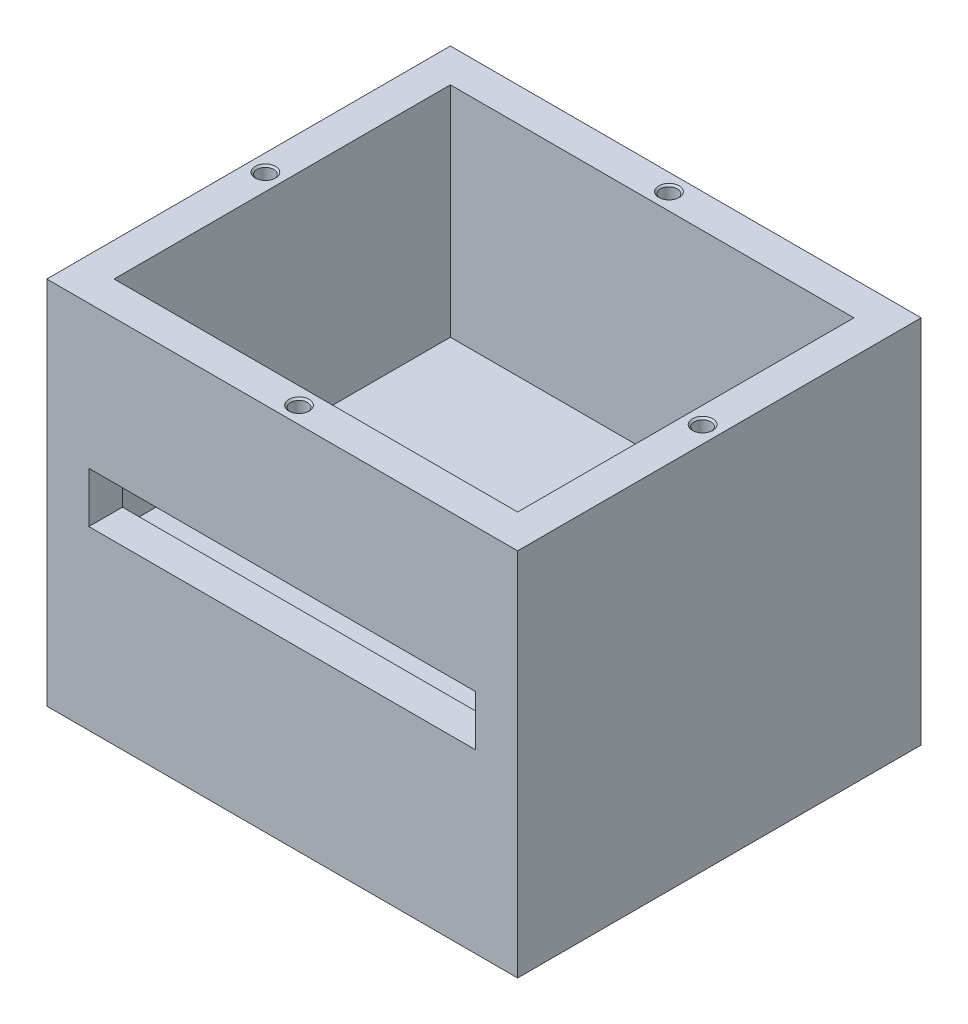
ISO-10303-21;
HEADER;
FILE_DESCRIPTION(('STEP AP214'),'2;1');
FILE_NAME('part.step','',(''),(''),'','','');
FILE_SCHEMA(('AUTOMOTIVE_DESIGN { 1 0 10303 214 1 1 1 1 }'));
ENDSEC;
DATA;
#1=APPLICATION_CONTEXT('core data for automotive mechanical design processes');
#2=APPLICATION_PROTOCOL_DEFINITION('international standard','automotive_design',2000,#1);
#3=PRODUCT_CONTEXT('',#1,'mechanical');
#4=PRODUCT('Part','Part','',(#3));
#5=PRODUCT_RELATED_PRODUCT_CATEGORY('part','',(#4));
#6=PRODUCT_DEFINITION_FORMATION('','',#4);
#7=PRODUCT_DEFINITION_CONTEXT('part definition',#1,'design');
#8=PRODUCT_DEFINITION('design','',#6,#7);
#9=PRODUCT_DEFINITION_SHAPE('','',#8);
#10=(LENGTH_UNIT() NAMED_UNIT(*) SI_UNIT(.MILLI.,.METRE.));
#11=(NAMED_UNIT(*) PLANE_ANGLE_UNIT() SI_UNIT($,.RADIAN.));
#12=(NAMED_UNIT(*) SI_UNIT($,.STERADIAN.) SOLID_ANGLE_UNIT());
#13=UNCERTAINTY_MEASURE_WITH_UNIT(LENGTH_MEASURE(1.E-05),#10,'distance_accuracy_value','');
#14=(GEOMETRIC_REPRESENTATION_CONTEXT(3) GLOBAL_UNCERTAINTY_ASSIGNED_CONTEXT((#13)) GLOBAL_UNIT_ASSIGNED_CONTEXT((#10,
#11,#12)) REPRESENTATION_CONTEXT('',''));
#15=CARTESIAN_POINT('',(0.,0.,0.));
#16=DIRECTION('',(0.,0.,1.));
#17=DIRECTION('',(1.,0.,0.));
#18=AXIS2_PLACEMENT_3D('',#15,#16,#17);
#19=CARTESIAN_POINT('',(0.,45.,0.));
#20=DIRECTION('',(0.,1.,0.));
#21=DIRECTION('',(0.,0.,1.));
#22=AXIS2_PLACEMENT_3D('',#19,#20,#21);
#23=PLANE('',#22);
#24=CARTESIAN_POINT('',(-15.,45.,0.));
#25=DIRECTION('',(0.,1.,0.));
#26=DIRECTION('',(0.,0.,1.));
#27=AXIS2_PLACEMENT_3D('',#24,#25,#26);
#28=CIRCLE('',#27,14.);
#29=CARTESIAN_POINT('',(-15.,45.,14.));
#30=VERTEX_POINT('',#29);
#31=EDGE_CURVE('E189',#30,#30,#28,.T.);
#32=ORIENTED_EDGE('',*,*,#31,.F.);
#33=EDGE_LOOP('',(#32));
#34=FACE_BOUND('',#33,.T.);
#35=CARTESIAN_POINT('',(15.,45.,0.));
#36=DIRECTION('',(0.,1.,0.));
#37=DIRECTION('',(0.,0.,-1.));
#38=AXIS2_PLACEMENT_3D('',#35,#36,#37);
#39=CIRCLE('',#38,14.);
#40=CARTESIAN_POINT('',(15.,45.,-14.));
#41=VERTEX_POINT('',#40);
#42=EDGE_CURVE('E184',#41,#41,#39,.T.);
#43=ORIENTED_EDGE('',*,*,#42,.F.);
#44=EDGE_LOOP('',(#43));
#45=FACE_BOUND('',#44,.T.);
#46=DIRECTION('',(0.,0.,1.));
#47=VECTOR('',#46,1.);
#48=CARTESIAN_POINT('',(-60.,45.,-50.));
#49=LINE('',#48,#47);
#50=CARTESIAN_POINT('',(-60.,45.,-50.));
#51=VERTEX_POINT('',#50);
#52=CARTESIAN_POINT('',(-60.,45.,50.));
#53=VERTEX_POINT('',#52);
#54=EDGE_CURVE('E232',#51,#53,#49,.T.);
#55=ORIENTED_EDGE('',*,*,#54,.T.);
#56=DIRECTION('',(1.,0.,0.));
#57=VECTOR('',#56,1.);
#58=CARTESIAN_POINT('',(-60.,45.,50.));
#59=LINE('',#58,#57);
#60=CARTESIAN_POINT('',(60.,45.,50.));
#61=VERTEX_POINT('',#60);
#62=EDGE_CURVE('E235',#53,#61,#59,.T.);
#63=ORIENTED_EDGE('',*,*,#62,.T.);
#64=DIRECTION('',(0.,0.,-1.));
#65=VECTOR('',#64,1.);
#66=CARTESIAN_POINT('',(60.,45.,-50.));
#67=LINE('',#66,#65);
#68=CARTESIAN_POINT('',(60.,45.,-50.));
#69=VERTEX_POINT('',#68);
#70=EDGE_CURVE('E239',#61,#69,#67,.T.);
#71=ORIENTED_EDGE('',*,*,#70,.T.);
#72=DIRECTION('',(-1.,0.,0.));
#73=VECTOR('',#72,1.);
#74=CARTESIAN_POINT('',(-60.,45.,-50.));
#75=LINE('',#74,#73);
#76=EDGE_CURVE('E242',#69,#51,#75,.T.);
#77=ORIENTED_EDGE('',*,*,#76,.T.);
#78=EDGE_LOOP('',(#55,#63,#71,#77));
#79=FACE_BOUND('',#78,.T.);
#80=ADVANCED_FACE('F39',(#34,#45,#79),#23,.T.);
#81=CARTESIAN_POINT('',(-70.,110.,60.));
#82=DIRECTION('',(1.,0.,0.));
#83=DIRECTION('',(0.,0.,-1.));
#84=AXIS2_PLACEMENT_3D('',#81,#82,#83);
#85=PLANE('',#84);
#86=DIRECTION('',(0.,0.,1.));
#87=VECTOR('',#86,1.);
#88=CARTESIAN_POINT('',(-70.,0.,60.));
#89=LINE('',#88,#87);
#90=CARTESIAN_POINT('',(-70.,0.,-60.));
#91=VERTEX_POINT('',#90);
#92=CARTESIAN_POINT('',(-70.,0.,60.));
#93=VERTEX_POINT('',#92);
#94=EDGE_CURVE('E257',#91,#93,#89,.T.);
#95=ORIENTED_EDGE('',*,*,#94,.T.);
#96=DIRECTION('',(0.,-1.,0.));
#97=VECTOR('',#96,1.);
#98=CARTESIAN_POINT('',(-70.,110.,60.));
#99=LINE('',#98,#97);
#100=CARTESIAN_POINT('',(-70.,110.,60.));
#101=VERTEX_POINT('',#100);
#102=EDGE_CURVE('E11',#101,#93,#99,.T.);
#103=ORIENTED_EDGE('',*,*,#102,.F.);
#104=DIRECTION('',(0.,0.,1.));
#105=VECTOR('',#104,1.);
#106=CARTESIAN_POINT('',(-70.,110.,60.));
#107=LINE('',#106,#105);
#108=CARTESIAN_POINT('',(-70.,110.,-60.));
#109=VERTEX_POINT('',#108);
#110=EDGE_CURVE('E264',#109,#101,#107,.T.);
#111=ORIENTED_EDGE('',*,*,#110,.F.);
#112=DIRECTION('',(0.,-1.,0.));
#113=VECTOR('',#112,1.);
#114=CARTESIAN_POINT('',(-70.,110.,-60.));
#115=LINE('',#114,#113);
#116=EDGE_CURVE('E274',#109,#91,#115,.T.);
#117=ORIENTED_EDGE('',*,*,#116,.T.);
#118=EDGE_LOOP('',(#95,#103,#111,#117));
#119=FACE_BOUND('',#118,.T.);
#120=ADVANCED_FACE('F41',(#119),#85,.F.);
#121=CARTESIAN_POINT('',(-70.,110.,60.));
#122=DIRECTION('',(0.,0.,-1.));
#123=DIRECTION('',(-1.,0.,0.));
#124=AXIS2_PLACEMENT_3D('',#121,#122,#123);
#125=PLANE('',#124);
#126=DIRECTION('',(1.,0.,0.));
#127=VECTOR('',#126,1.);
#128=CARTESIAN_POINT('',(-57.5,52.5,60.));
#129=LINE('',#128,#127);
#130=CARTESIAN_POINT('',(-57.5,52.5,60.));
#131=VERTEX_POINT('',#130);
#132=CARTESIAN_POINT('',(57.5,52.5,60.));
#133=VERTEX_POINT('',#132);
#134=EDGE_CURVE('E216',#131,#133,#129,.T.);
#135=ORIENTED_EDGE('',*,*,#134,.F.);
#136=DIRECTION('',(0.,-1.,0.));
#137=VECTOR('',#136,1.);
#138=CARTESIAN_POINT('',(-57.5,67.5,60.));
#139=LINE('',#138,#137);
#140=CARTESIAN_POINT('',(-57.5,67.5,60.));
#141=VERTEX_POINT('',#140);
#142=EDGE_CURVE('E56',#141,#131,#139,.T.);
#143=ORIENTED_EDGE('',*,*,#142,.F.);
#144=DIRECTION('',(-1.,0.,0.));
#145=VECTOR('',#144,1.);
#146=CARTESIAN_POINT('',(-57.5,67.5,60.));
#147=LINE('',#146,#145);
#148=CARTESIAN_POINT('',(57.5,67.5,60.));
#149=VERTEX_POINT('',#148);
#150=EDGE_CURVE('E207',#149,#141,#147,.T.);
#151=ORIENTED_EDGE('',*,*,#150,.F.);
#152=DIRECTION('',(0.,1.,0.));
#153=VECTOR('',#152,1.);
#154=CARTESIAN_POINT('',(57.5,67.5,60.));
#155=LINE('',#154,#153);
#156=EDGE_CURVE('E219',#133,#149,#155,.T.);
#157=ORIENTED_EDGE('',*,*,#156,.F.);
#158=EDGE_LOOP('',(#135,#143,#151,#157));
#159=FACE_BOUND('',#158,.T.);
#160=DIRECTION('',(1.,0.,0.));
#161=VECTOR('',#160,1.);
#162=CARTESIAN_POINT('',(-70.,0.,60.));
#163=LINE('',#162,#161);
#164=CARTESIAN_POINT('',(70.,0.,60.));
#165=VERTEX_POINT('',#164);
#166=EDGE_CURVE('E277',#93,#165,#163,.T.);
#167=ORIENTED_EDGE('',*,*,#166,.T.);
#168=DIRECTION('',(0.,-1.,0.));
#169=VECTOR('',#168,1.);
#170=CARTESIAN_POINT('',(70.,110.,60.));
#171=LINE('',#170,#169);
#172=CARTESIAN_POINT('',(70.,110.,60.));
#173=VERTEX_POINT('',#172);
#174=EDGE_CURVE('E48',#173,#165,#171,.T.);
#175=ORIENTED_EDGE('',*,*,#174,.F.);
#176=DIRECTION('',(1.,0.,0.));
#177=VECTOR('',#176,1.);
#178=CARTESIAN_POINT('',(-70.,110.,60.));
#179=LINE('',#178,#177);
#180=EDGE_CURVE('E267',#101,#173,#179,.T.);
#181=ORIENTED_EDGE('',*,*,#180,.F.);
#182=ORIENTED_EDGE('',*,*,#102,.T.);
#183=EDGE_LOOP('',(#167,#175,#181,#182));
#184=FACE_BOUND('',#183,.T.);
#185=ADVANCED_FACE('F347',(#159,#184),#125,.F.);
#186=CARTESIAN_POINT('',(70.,110.,60.));
#187=DIRECTION('',(-1.,0.,0.));
#188=DIRECTION('',(0.,0.,1.));
#189=AXIS2_PLACEMENT_3D('',#186,#187,#188);
#190=PLANE('',#189);
#191=DIRECTION('',(0.,0.,-1.));
#192=VECTOR('',#191,1.);
#193=CARTESIAN_POINT('',(70.,0.,60.));
#194=LINE('',#193,#192);
#195=CARTESIAN_POINT('',(70.,0.,-60.));
#196=VERTEX_POINT('',#195);
#197=EDGE_CURVE('E279',#165,#196,#194,.T.);
#198=ORIENTED_EDGE('',*,*,#197,.T.);
#199=DIRECTION('',(0.,-1.,0.));
#200=VECTOR('',#199,1.);
#201=CARTESIAN_POINT('',(70.,110.,-60.));
#202=LINE('',#201,#200);
#203=CARTESIAN_POINT('',(70.,110.,-60.));
#204=VERTEX_POINT('',#203);
#205=EDGE_CURVE('E284',#204,#196,#202,.T.);
#206=ORIENTED_EDGE('',*,*,#205,.F.);
#207=DIRECTION('',(0.,0.,-1.));
#208=VECTOR('',#207,1.);
#209=CARTESIAN_POINT('',(70.,110.,60.));
#210=LINE('',#209,#208);
#211=EDGE_CURVE('E270',#173,#204,#210,.T.);
#212=ORIENTED_EDGE('',*,*,#211,.F.);
#213=ORIENTED_EDGE('',*,*,#174,.T.);
#214=EDGE_LOOP('',(#198,#206,#212,#213));
#215=FACE_BOUND('',#214,.T.);
#216=ADVANCED_FACE('F352',(#215),#190,.F.);
#217=CARTESIAN_POINT('',(-70.,110.,-60.));
#218=DIRECTION('',(0.,0.,1.));
#219=DIRECTION('',(1.,0.,0.));
#220=AXIS2_PLACEMENT_3D('',#217,#218,#219);
#221=PLANE('',#220);
#222=DIRECTION('',(-1.,0.,0.));
#223=VECTOR('',#222,1.);
#224=CARTESIAN_POINT('',(-70.,0.,-60.));
#225=LINE('',#224,#223);
#226=EDGE_CURVE('E268',#196,#91,#225,.T.);
#227=ORIENTED_EDGE('',*,*,#226,.T.);
#228=ORIENTED_EDGE('',*,*,#116,.F.);
#229=DIRECTION('',(-1.,0.,0.));
#230=VECTOR('',#229,1.);
#231=CARTESIAN_POINT('',(-70.,110.,-60.));
#232=LINE('',#231,#230);
#233=EDGE_CURVE('E272',#204,#109,#232,.T.);
#234=ORIENTED_EDGE('',*,*,#233,.F.);
#235=ORIENTED_EDGE('',*,*,#205,.T.);
#236=EDGE_LOOP('',(#227,#228,#234,#235));
#237=FACE_BOUND('',#236,.T.);
#238=ADVANCED_FACE('F336',(#237),#221,.F.);
#239=CARTESIAN_POINT('',(0.,110.,0.));
#240=DIRECTION('',(0.,-1.,0.));
#241=DIRECTION('',(0.,0.,-1.));
#242=AXIS2_PLACEMENT_3D('',#239,#240,#241);
#243=PLANE('',#242);
#244=CARTESIAN_POINT('',(65.,110.,0.));
#245=DIRECTION('',(0.,1.,0.));
#246=DIRECTION('',(0.,0.,1.));
#247=AXIS2_PLACEMENT_3D('',#244,#245,#246);
#248=CIRCLE('',#247,3.025);
#249=CARTESIAN_POINT('',(65.,110.,3.025));
#250=VERTEX_POINT('',#249);
#251=EDGE_CURVE('E157',#250,#250,#248,.T.);
#252=ORIENTED_EDGE('',*,*,#251,.F.);
#253=EDGE_LOOP('',(#252));
#254=FACE_BOUND('',#253,.T.);
#255=CARTESIAN_POINT('',(0.,110.,55.));
#256=DIRECTION('',(0.,1.,0.));
#257=DIRECTION('',(0.,0.,1.));
#258=AXIS2_PLACEMENT_3D('',#255,#256,#257);
#259=CIRCLE('',#258,3.025);
#260=CARTESIAN_POINT('',(0.,110.,58.025));
#261=VERTEX_POINT('',#260);
#262=EDGE_CURVE('E150',#261,#261,#259,.T.);
#263=ORIENTED_EDGE('',*,*,#262,.F.);
#264=EDGE_LOOP('',(#263));
#265=FACE_BOUND('',#264,.T.);
#266=CARTESIAN_POINT('',(0.,110.,-55.));
#267=DIRECTION('',(0.,1.,0.));
#268=DIRECTION('',(0.,0.,1.));
#269=AXIS2_PLACEMENT_3D('',#266,#267,#268);
#270=CIRCLE('',#269,3.025);
#271=CARTESIAN_POINT('',(0.,110.,-51.975));
#272=VERTEX_POINT('',#271);
#273=EDGE_CURVE('E166',#272,#272,#270,.T.);
#274=ORIENTED_EDGE('',*,*,#273,.F.);
#275=EDGE_LOOP('',(#274));
#276=FACE_BOUND('',#275,.T.);
#277=CARTESIAN_POINT('',(-65.,110.,0.));
#278=DIRECTION('',(0.,1.,0.));
#279=DIRECTION('',(0.,0.,1.));
#280=AXIS2_PLACEMENT_3D('',#277,#278,#279);
#281=CIRCLE('',#280,3.025);
#282=CARTESIAN_POINT('',(-65.,110.,3.025));
#283=VERTEX_POINT('',#282);
#284=EDGE_CURVE('E175',#283,#283,#281,.T.);
#285=ORIENTED_EDGE('',*,*,#284,.F.);
#286=EDGE_LOOP('',(#285));
#287=FACE_BOUND('',#286,.T.);
#288=DIRECTION('',(1.,0.,0.));
#289=VECTOR('',#288,1.);
#290=CARTESIAN_POINT('',(-60.,110.,50.));
#291=LINE('',#290,#289);
#292=CARTESIAN_POINT('',(-60.,110.,50.));
#293=VERTEX_POINT('',#292);
#294=CARTESIAN_POINT('',(60.,110.,50.));
#295=VERTEX_POINT('',#294);
#296=EDGE_CURVE('E247',#293,#295,#291,.T.);
#297=ORIENTED_EDGE('',*,*,#296,.F.);
#298=DIRECTION('',(0.,0.,1.));
#299=VECTOR('',#298,1.);
#300=CARTESIAN_POINT('',(-60.,110.,-50.));
#301=LINE('',#300,#299);
#302=CARTESIAN_POINT('',(-60.,110.,-50.));
#303=VERTEX_POINT('',#302);
#304=EDGE_CURVE('E226',#303,#293,#301,.T.);
#305=ORIENTED_EDGE('',*,*,#304,.F.);
#306=DIRECTION('',(-1.,0.,0.));
#307=VECTOR('',#306,1.);
#308=CARTESIAN_POINT('',(-60.,110.,-50.));
#309=LINE('',#308,#307);
#310=CARTESIAN_POINT('',(60.,110.,-50.));
#311=VERTEX_POINT('',#310);
#312=EDGE_CURVE('E236',#311,#303,#309,.T.);
#313=ORIENTED_EDGE('',*,*,#312,.F.);
#314=DIRECTION('',(0.,0.,-1.));
#315=VECTOR('',#314,1.);
#316=CARTESIAN_POINT('',(60.,110.,-50.));
#317=LINE('',#316,#315);
#318=EDGE_CURVE('E250',#295,#311,#317,.T.);
#319=ORIENTED_EDGE('',*,*,#318,.F.);
#320=EDGE_LOOP('',(#297,#305,#313,#319));
#321=FACE_BOUND('',#320,.T.);
#322=ORIENTED_EDGE('',*,*,#110,.T.);
#323=ORIENTED_EDGE('',*,*,#180,.T.);
#324=ORIENTED_EDGE('',*,*,#211,.T.);
#325=ORIENTED_EDGE('',*,*,#233,.T.);
#326=EDGE_LOOP('',(#322,#323,#324,#325));
#327=FACE_BOUND('',#326,.T.);
#328=ADVANCED_FACE('F332',(#254,#265,#276,#287,#321,#327),#243,.F.);
#329=CARTESIAN_POINT('',(0.,0.,0.));
#330=DIRECTION('',(0.,-1.,0.));
#331=DIRECTION('',(0.,0.,-1.));
#332=AXIS2_PLACEMENT_3D('',#329,#330,#331);
#333=PLANE('',#332);
#334=ORIENTED_EDGE('',*,*,#94,.F.);
#335=ORIENTED_EDGE('',*,*,#226,.F.);
#336=ORIENTED_EDGE('',*,*,#197,.F.);
#337=ORIENTED_EDGE('',*,*,#166,.F.);
#338=EDGE_LOOP('',(#334,#335,#336,#337));
#339=FACE_BOUND('',#338,.T.);
#340=ADVANCED_FACE('F335',(#339),#333,.T.);
#341=CARTESIAN_POINT('',(-60.,45.,-50.));
#342=DIRECTION('',(-1.,0.,0.));
#343=DIRECTION('',(0.,0.,1.));
#344=AXIS2_PLACEMENT_3D('',#341,#342,#343);
#345=PLANE('',#344);
#346=ORIENTED_EDGE('',*,*,#304,.T.);
#347=DIRECTION('',(0.,1.,0.));
#348=VECTOR('',#347,1.);
#349=CARTESIAN_POINT('',(-60.,45.,50.));
#350=LINE('',#349,#348);
#351=EDGE_CURVE('E245',#53,#293,#350,.T.);
#352=ORIENTED_EDGE('',*,*,#351,.F.);
#353=ORIENTED_EDGE('',*,*,#54,.F.);
#354=DIRECTION('',(0.,1.,0.));
#355=VECTOR('',#354,1.);
#356=CARTESIAN_POINT('',(-60.,45.,-50.));
#357=LINE('',#356,#355);
#358=EDGE_CURVE('E255',#51,#303,#357,.T.);
#359=ORIENTED_EDGE('',*,*,#358,.T.);
#360=EDGE_LOOP('',(#346,#352,#353,#359));
#361=FACE_BOUND('',#360,.T.);
#362=ADVANCED_FACE('F319',(#361),#345,.F.);
#363=CARTESIAN_POINT('',(-60.,45.,-50.));
#364=DIRECTION('',(0.,0.,-1.));
#365=DIRECTION('',(-1.,0.,0.));
#366=AXIS2_PLACEMENT_3D('',#363,#364,#365);
#367=PLANE('',#366);
#368=ORIENTED_EDGE('',*,*,#312,.T.);
#369=ORIENTED_EDGE('',*,*,#358,.F.);
#370=ORIENTED_EDGE('',*,*,#76,.F.);
#371=DIRECTION('',(0.,1.,0.));
#372=VECTOR('',#371,1.);
#373=CARTESIAN_POINT('',(60.,45.,-50.));
#374=LINE('',#373,#372);
#375=EDGE_CURVE('E258',#69,#311,#374,.T.);
#376=ORIENTED_EDGE('',*,*,#375,.T.);
#377=EDGE_LOOP('',(#368,#369,#370,#376));
#378=FACE_BOUND('',#377,.T.);
#379=ADVANCED_FACE('F329',(#378),#367,.F.);
#380=CARTESIAN_POINT('',(60.,45.,-50.));
#381=DIRECTION('',(1.,0.,0.));
#382=DIRECTION('',(0.,0.,-1.));
#383=AXIS2_PLACEMENT_3D('',#380,#381,#382);
#384=PLANE('',#383);
#385=ORIENTED_EDGE('',*,*,#318,.T.);
#386=ORIENTED_EDGE('',*,*,#375,.F.);
#387=ORIENTED_EDGE('',*,*,#70,.F.);
#388=DIRECTION('',(0.,1.,0.));
#389=VECTOR('',#388,1.);
#390=CARTESIAN_POINT('',(60.,45.,50.));
#391=LINE('',#390,#389);
#392=EDGE_CURVE('E260',#61,#295,#391,.T.);
#393=ORIENTED_EDGE('',*,*,#392,.T.);
#394=EDGE_LOOP('',(#385,#386,#387,#393));
#395=FACE_BOUND('',#394,.T.);
#396=ADVANCED_FACE('F327',(#395),#384,.F.);
#397=CARTESIAN_POINT('',(-60.,45.,50.));
#398=DIRECTION('',(0.,0.,1.));
#399=DIRECTION('',(1.,0.,0.));
#400=AXIS2_PLACEMENT_3D('',#397,#398,#399);
#401=PLANE('',#400);
#402=DIRECTION('',(-1.,0.,0.));
#403=VECTOR('',#402,1.);
#404=CARTESIAN_POINT('',(-57.5,67.5,50.));
#405=LINE('',#404,#403);
#406=CARTESIAN_POINT('',(57.5,67.5,50.));
#407=VERTEX_POINT('',#406);
#408=CARTESIAN_POINT('',(-57.5,67.5,50.));
#409=VERTEX_POINT('',#408);
#410=EDGE_CURVE('E211',#407,#409,#405,.T.);
#411=ORIENTED_EDGE('',*,*,#410,.T.);
#412=DIRECTION('',(0.,-1.,0.));
#413=VECTOR('',#412,1.);
#414=CARTESIAN_POINT('',(-57.5,67.5,50.));
#415=LINE('',#414,#413);
#416=CARTESIAN_POINT('',(-57.5,52.5,50.));
#417=VERTEX_POINT('',#416);
#418=EDGE_CURVE('E203',#409,#417,#415,.T.);
#419=ORIENTED_EDGE('',*,*,#418,.T.);
#420=DIRECTION('',(1.,0.,0.));
#421=VECTOR('',#420,1.);
#422=CARTESIAN_POINT('',(-57.5,52.5,50.));
#423=LINE('',#422,#421);
#424=CARTESIAN_POINT('',(57.5,52.5,50.));
#425=VERTEX_POINT('',#424);
#426=EDGE_CURVE('E206',#417,#425,#423,.T.);
#427=ORIENTED_EDGE('',*,*,#426,.T.);
#428=DIRECTION('',(0.,1.,0.));
#429=VECTOR('',#428,1.);
#430=CARTESIAN_POINT('',(57.5,67.5,50.));
#431=LINE('',#430,#429);
#432=EDGE_CURVE('E64',#425,#407,#431,.T.);
#433=ORIENTED_EDGE('',*,*,#432,.T.);
#434=EDGE_LOOP('',(#411,#419,#427,#433));
#435=FACE_BOUND('',#434,.T.);
#436=ORIENTED_EDGE('',*,*,#296,.T.);
#437=ORIENTED_EDGE('',*,*,#392,.F.);
#438=ORIENTED_EDGE('',*,*,#62,.F.);
#439=ORIENTED_EDGE('',*,*,#351,.T.);
#440=EDGE_LOOP('',(#436,#437,#438,#439));
#441=FACE_BOUND('',#440,.T.);
#442=ADVANCED_FACE('F323',(#435,#441),#401,.F.);
#443=CARTESIAN_POINT('',(-57.5,67.5,50.));
#444=DIRECTION('',(-1.,0.,0.));
#445=DIRECTION('',(0.,0.,1.));
#446=AXIS2_PLACEMENT_3D('',#443,#444,#445);
#447=PLANE('',#446);
#448=ORIENTED_EDGE('',*,*,#142,.T.);
#449=DIRECTION('',(0.,0.,1.));
#450=VECTOR('',#449,1.);
#451=CARTESIAN_POINT('',(-57.5,52.5,50.));
#452=LINE('',#451,#450);
#453=EDGE_CURVE('E214',#417,#131,#452,.T.);
#454=ORIENTED_EDGE('',*,*,#453,.F.);
#455=ORIENTED_EDGE('',*,*,#418,.F.);
#456=DIRECTION('',(0.,0.,1.));
#457=VECTOR('',#456,1.);
#458=CARTESIAN_POINT('',(-57.5,67.5,50.));
#459=LINE('',#458,#457);
#460=EDGE_CURVE('E224',#409,#141,#459,.T.);
#461=ORIENTED_EDGE('',*,*,#460,.T.);
#462=EDGE_LOOP('',(#448,#454,#455,#461));
#463=FACE_BOUND('',#462,.T.);
#464=ADVANCED_FACE('F378',(#463),#447,.F.);
#465=CARTESIAN_POINT('',(-57.5,67.5,50.));
#466=DIRECTION('',(0.,1.,0.));
#467=DIRECTION('',(0.,0.,1.));
#468=AXIS2_PLACEMENT_3D('',#465,#466,#467);
#469=PLANE('',#468);
#470=ORIENTED_EDGE('',*,*,#150,.T.);
#471=ORIENTED_EDGE('',*,*,#460,.F.);
#472=ORIENTED_EDGE('',*,*,#410,.F.);
#473=DIRECTION('',(0.,0.,1.));
#474=VECTOR('',#473,1.);
#475=CARTESIAN_POINT('',(57.5,67.5,50.));
#476=LINE('',#475,#474);
#477=EDGE_CURVE('E227',#407,#149,#476,.T.);
#478=ORIENTED_EDGE('',*,*,#477,.T.);
#479=EDGE_LOOP('',(#470,#471,#472,#478));
#480=FACE_BOUND('',#479,.T.);
#481=ADVANCED_FACE('F382',(#480),#469,.F.);
#482=CARTESIAN_POINT('',(57.5,67.5,50.));
#483=DIRECTION('',(1.,0.,0.));
#484=DIRECTION('',(0.,0.,-1.));
#485=AXIS2_PLACEMENT_3D('',#482,#483,#484);
#486=PLANE('',#485);
#487=ORIENTED_EDGE('',*,*,#156,.T.);
#488=ORIENTED_EDGE('',*,*,#477,.F.);
#489=ORIENTED_EDGE('',*,*,#432,.F.);
#490=DIRECTION('',(0.,0.,1.));
#491=VECTOR('',#490,1.);
#492=CARTESIAN_POINT('',(57.5,52.5,50.));
#493=LINE('',#492,#491);
#494=EDGE_CURVE('E229',#425,#133,#493,.T.);
#495=ORIENTED_EDGE('',*,*,#494,.T.);
#496=EDGE_LOOP('',(#487,#488,#489,#495));
#497=FACE_BOUND('',#496,.T.);
#498=ADVANCED_FACE('F383',(#497),#486,.F.);
#499=CARTESIAN_POINT('',(-57.5,52.5,50.));
#500=DIRECTION('',(0.,-1.,0.));
#501=DIRECTION('',(0.,0.,-1.));
#502=AXIS2_PLACEMENT_3D('',#499,#500,#501);
#503=PLANE('',#502);
#504=ORIENTED_EDGE('',*,*,#134,.T.);
#505=ORIENTED_EDGE('',*,*,#494,.F.);
#506=ORIENTED_EDGE('',*,*,#426,.F.);
#507=ORIENTED_EDGE('',*,*,#453,.T.);
#508=EDGE_LOOP('',(#504,#505,#506,#507));
#509=FACE_BOUND('',#508,.T.);
#510=ADVANCED_FACE('F375',(#509),#503,.F.);
#511=CARTESIAN_POINT('',(15.,35.,0.));
#512=DIRECTION('',(0.,-1.,0.));
#513=DIRECTION('',(0.,0.,-1.));
#514=AXIS2_PLACEMENT_3D('',#511,#512,#513);
#515=PLANE('',#514);
#516=CARTESIAN_POINT('',(15.,35.,0.));
#517=DIRECTION('',(0.,1.,0.));
#518=DIRECTION('',(0.,0.,-1.));
#519=AXIS2_PLACEMENT_3D('',#516,#517,#518);
#520=CIRCLE('',#519,14.);
#521=CARTESIAN_POINT('',(15.,35.,-14.));
#522=VERTEX_POINT('',#521);
#523=EDGE_CURVE('E192',#522,#522,#520,.T.);
#524=ORIENTED_EDGE('',*,*,#523,.T.);
#525=EDGE_LOOP('',(#524));
#526=FACE_BOUND('',#525,.T.);
#527=CARTESIAN_POINT('',(15.,35.,0.));
#528=DIRECTION('',(0.,-1.,0.));
#529=DIRECTION('',(0.,0.,-1.));
#530=AXIS2_PLACEMENT_3D('',#527,#528,#529);
#531=CIRCLE('',#530,7.5);
#532=CARTESIAN_POINT('',(15.,35.,-7.5));
#533=VERTEX_POINT('',#532);
#534=EDGE_CURVE('E188',#533,#533,#531,.F.);
#535=ORIENTED_EDGE('',*,*,#534,.F.);
#536=EDGE_LOOP('',(#535));
#537=FACE_BOUND('',#536,.T.);
#538=ADVANCED_FACE('F390',(#526,#537),#515,.F.);
#539=CARTESIAN_POINT('',(15.,35.,0.));
#540=DIRECTION('',(0.,1.,0.));
#541=DIRECTION('',(0.,0.,1.));
#542=AXIS2_PLACEMENT_3D('',#539,#540,#541);
#543=CYLINDRICAL_SURFACE('',#542,14.);
#544=ORIENTED_EDGE('',*,*,#523,.F.);
#545=EDGE_LOOP('',(#544));
#546=FACE_BOUND('',#545,.T.);
#547=ORIENTED_EDGE('',*,*,#42,.T.);
#548=EDGE_LOOP('',(#547));
#549=FACE_BOUND('',#548,.T.);
#550=ADVANCED_FACE('F306',(#546,#549),#543,.F.);
#551=CARTESIAN_POINT('',(-15.,35.,0.));
#552=DIRECTION('',(0.,1.,0.));
#553=DIRECTION('',(0.,0.,1.));
#554=AXIS2_PLACEMENT_3D('',#551,#552,#553);
#555=CYLINDRICAL_SURFACE('',#554,14.);
#556=CARTESIAN_POINT('',(-15.,35.,0.));
#557=DIRECTION('',(0.,1.,0.));
#558=DIRECTION('',(0.,0.,1.));
#559=AXIS2_PLACEMENT_3D('',#556,#557,#558);
#560=CIRCLE('',#559,14.);
#561=CARTESIAN_POINT('',(-15.,35.,14.));
#562=VERTEX_POINT('',#561);
#563=EDGE_CURVE('E185',#562,#562,#560,.T.);
#564=ORIENTED_EDGE('',*,*,#563,.F.);
#565=EDGE_LOOP('',(#564));
#566=FACE_BOUND('',#565,.T.);
#567=ORIENTED_EDGE('',*,*,#31,.T.);
#568=EDGE_LOOP('',(#567));
#569=FACE_BOUND('',#568,.T.);
#570=ADVANCED_FACE('F300',(#566,#569),#555,.F.);
#571=CARTESIAN_POINT('',(-15.,35.,0.));
#572=DIRECTION('',(0.,1.,0.));
#573=DIRECTION('',(0.,0.,1.));
#574=AXIS2_PLACEMENT_3D('',#571,#572,#573);
#575=PLANE('',#574);
#576=CARTESIAN_POINT('',(-15.,35.,0.));
#577=DIRECTION('',(0.,1.,0.));
#578=DIRECTION('',(0.,0.,1.));
#579=AXIS2_PLACEMENT_3D('',#576,#577,#578);
#580=CIRCLE('',#579,7.5);
#581=CARTESIAN_POINT('',(-15.,35.,7.5));
#582=VERTEX_POINT('',#581);
#583=EDGE_CURVE('E43',#582,#582,#580,.T.);
#584=ORIENTED_EDGE('',*,*,#583,.F.);
#585=EDGE_LOOP('',(#584));
#586=FACE_BOUND('',#585,.T.);
#587=ORIENTED_EDGE('',*,*,#563,.T.);
#588=EDGE_LOOP('',(#587));
#589=FACE_BOUND('',#588,.T.);
#590=ADVANCED_FACE('F296',(#586,#589),#575,.T.);
#591=CARTESIAN_POINT('',(15.,9.99999999999999,0.));
#592=DIRECTION('',(0.,1.,0.));
#593=DIRECTION('',(0.,0.,1.));
#594=AXIS2_PLACEMENT_3D('',#591,#592,#593);
#595=PLANE('',#594);
#596=CARTESIAN_POINT('',(15.,9.99999999999999,0.));
#597=DIRECTION('',(0.,1.,0.));
#598=DIRECTION('',(0.,0.,1.));
#599=AXIS2_PLACEMENT_3D('',#596,#597,#598);
#600=CIRCLE('',#599,7.5);
#601=CARTESIAN_POINT('',(15.,9.99999999999999,7.5));
#602=VERTEX_POINT('',#601);
#603=EDGE_CURVE('E197',#602,#602,#600,.T.);
#604=ORIENTED_EDGE('',*,*,#603,.T.);
#605=EDGE_LOOP('',(#604));
#606=FACE_BOUND('',#605,.T.);
#607=ADVANCED_FACE('F299',(#606),#595,.T.);
#608=CARTESIAN_POINT('',(15.,9.99999999999999,0.));
#609=DIRECTION('',(0.,1.,0.));
#610=DIRECTION('',(0.,0.,1.));
#611=AXIS2_PLACEMENT_3D('',#608,#609,#610);
#612=CYLINDRICAL_SURFACE('',#611,7.5);
#613=ORIENTED_EDGE('',*,*,#534,.T.);
#614=EDGE_LOOP('',(#613));
#615=FACE_BOUND('',#614,.T.);
#616=ORIENTED_EDGE('',*,*,#603,.F.);
#617=EDGE_LOOP('',(#616));
#618=FACE_BOUND('',#617,.T.);
#619=ADVANCED_FACE('F436',(#615,#618),#612,.F.);
#620=CARTESIAN_POINT('',(-15.,9.99999999999999,0.));
#621=DIRECTION('',(0.,-1.,0.));
#622=DIRECTION('',(0.,0.,-1.));
#623=AXIS2_PLACEMENT_3D('',#620,#621,#622);
#624=PLANE('',#623);
#625=CARTESIAN_POINT('',(-15.,9.99999999999999,0.));
#626=DIRECTION('',(0.,-1.,0.));
#627=DIRECTION('',(0.,0.,-1.));
#628=AXIS2_PLACEMENT_3D('',#625,#626,#627);
#629=CIRCLE('',#628,7.5);
#630=CARTESIAN_POINT('',(-15.,9.99999999999999,-7.5));
#631=VERTEX_POINT('',#630);
#632=EDGE_CURVE('E200',#631,#631,#629,.T.);
#633=ORIENTED_EDGE('',*,*,#632,.F.);
#634=EDGE_LOOP('',(#633));
#635=FACE_BOUND('',#634,.T.);
#636=ADVANCED_FACE('F431',(#635),#624,.F.);
#637=CARTESIAN_POINT('',(-15.,9.99999999999999,0.));
#638=DIRECTION('',(0.,1.,0.));
#639=DIRECTION('',(0.,0.,1.));
#640=AXIS2_PLACEMENT_3D('',#637,#638,#639);
#641=CYLINDRICAL_SURFACE('',#640,7.5);
#642=ORIENTED_EDGE('',*,*,#632,.T.);
#643=EDGE_LOOP('',(#642));
#644=FACE_BOUND('',#643,.T.);
#645=ORIENTED_EDGE('',*,*,#583,.T.);
#646=EDGE_LOOP('',(#645));
#647=FACE_BOUND('',#646,.T.);
#648=ADVANCED_FACE('F294',(#644,#647),#641,.F.);
#649=CARTESIAN_POINT('',(-65.,97.,0.));
#650=DIRECTION('',(0.,1.,0.));
#651=DIRECTION('',(0.,0.,1.));
#652=AXIS2_PLACEMENT_3D('',#649,#650,#651);
#653=CONICAL_SURFACE('',#652,2.5,1.02974425867666);
#654=CARTESIAN_POINT('',(-65.,95.4978484524311,0.));
#655=VERTEX_POINT('',#654);
#656=VERTEX_LOOP('',#655);
#657=FACE_BOUND('',#656,.T.);
#658=CARTESIAN_POINT('',(-65.,97.,0.));
#659=DIRECTION('',(0.,1.,0.));
#660=DIRECTION('',(0.,0.,1.));
#661=AXIS2_PLACEMENT_3D('',#658,#659,#660);
#662=CIRCLE('',#661,2.5);
#663=CARTESIAN_POINT('',(-65.,97.,2.5));
#664=VERTEX_POINT('',#663);
#665=EDGE_CURVE('E181',#664,#664,#662,.T.);
#666=ORIENTED_EDGE('',*,*,#665,.T.);
#667=EDGE_LOOP('',(#666));
#668=FACE_BOUND('',#667,.T.);
#669=ADVANCED_FACE('F497',(#657,#668),#653,.F.);
#670=CARTESIAN_POINT('',(-65.,110.,0.));
#671=DIRECTION('',(0.,1.,0.));
#672=DIRECTION('',(0.,0.,1.));
#673=AXIS2_PLACEMENT_3D('',#670,#671,#672);
#674=CYLINDRICAL_SURFACE('',#673,2.5);
#675=ORIENTED_EDGE('',*,*,#665,.F.);
#676=EDGE_LOOP('',(#675));
#677=FACE_BOUND('',#676,.T.);
#678=CARTESIAN_POINT('',(-65.,109.475,0.));
#679=DIRECTION('',(0.,1.,0.));
#680=DIRECTION('',(0.,0.,1.));
#681=AXIS2_PLACEMENT_3D('',#678,#679,#680);
#682=CIRCLE('',#681,2.5);
#683=CARTESIAN_POINT('',(-65.,109.475,2.5));
#684=VERTEX_POINT('',#683);
#685=EDGE_CURVE('E178',#684,#684,#682,.T.);
#686=ORIENTED_EDGE('',*,*,#685,.T.);
#687=EDGE_LOOP('',(#686));
#688=FACE_BOUND('',#687,.T.);
#689=ADVANCED_FACE('F506',(#677,#688),#674,.F.);
#690=CARTESIAN_POINT('',(-65.,110.,0.));
#691=DIRECTION('',(0.,1.,0.));
#692=DIRECTION('',(0.,0.,1.));
#693=AXIS2_PLACEMENT_3D('',#690,#691,#692);
#694=CONICAL_SURFACE('',#693,3.025,0.785398163397448);
#695=ORIENTED_EDGE('',*,*,#685,.F.);
#696=EDGE_LOOP('',(#695));
#697=FACE_BOUND('',#696,.T.);
#698=ORIENTED_EDGE('',*,*,#284,.T.);
#699=EDGE_LOOP('',(#698));
#700=FACE_BOUND('',#699,.T.);
#701=ADVANCED_FACE('F517',(#697,#700),#694,.F.);
#702=CARTESIAN_POINT('',(0.,97.,-55.));
#703=DIRECTION('',(0.,1.,0.));
#704=DIRECTION('',(0.,0.,1.));
#705=AXIS2_PLACEMENT_3D('',#702,#703,#704);
#706=CONICAL_SURFACE('',#705,2.5,1.02974425867665);
#707=CARTESIAN_POINT('',(0.,95.4978484524311,-55.));
#708=VERTEX_POINT('',#707);
#709=VERTEX_LOOP('',#708);
#710=FACE_BOUND('',#709,.T.);
#711=CARTESIAN_POINT('',(0.,97.,-55.));
#712=DIRECTION('',(0.,1.,0.));
#713=DIRECTION('',(0.,0.,1.));
#714=AXIS2_PLACEMENT_3D('',#711,#712,#713);
#715=CIRCLE('',#714,2.5);
#716=CARTESIAN_POINT('',(0.,97.,-52.5));
#717=VERTEX_POINT('',#716);
#718=EDGE_CURVE('E172',#717,#717,#715,.T.);
#719=ORIENTED_EDGE('',*,*,#718,.T.);
#720=EDGE_LOOP('',(#719));
#721=FACE_BOUND('',#720,.T.);
#722=ADVANCED_FACE('F529',(#710,#721),#706,.F.);
#723=CARTESIAN_POINT('',(0.,110.,-55.));
#724=DIRECTION('',(0.,1.,0.));
#725=DIRECTION('',(0.,0.,1.));
#726=AXIS2_PLACEMENT_3D('',#723,#724,#725);
#727=CYLINDRICAL_SURFACE('',#726,2.5);
#728=ORIENTED_EDGE('',*,*,#718,.F.);
#729=EDGE_LOOP('',(#728));
#730=FACE_BOUND('',#729,.T.);
#731=CARTESIAN_POINT('',(0.,109.475,-55.));
#732=DIRECTION('',(0.,1.,0.));
#733=DIRECTION('',(0.,0.,1.));
#734=AXIS2_PLACEMENT_3D('',#731,#732,#733);
#735=CIRCLE('',#734,2.5);
#736=CARTESIAN_POINT('',(0.,109.475,-52.5));
#737=VERTEX_POINT('',#736);
#738=EDGE_CURVE('E169',#737,#737,#735,.T.);
#739=ORIENTED_EDGE('',*,*,#738,.T.);
#740=EDGE_LOOP('',(#739));
#741=FACE_BOUND('',#740,.T.);
#742=ADVANCED_FACE('F539',(#730,#741),#727,.F.);
#743=CARTESIAN_POINT('',(0.,110.,-55.));
#744=DIRECTION('',(0.,1.,0.));
#745=DIRECTION('',(0.,0.,1.));
#746=AXIS2_PLACEMENT_3D('',#743,#744,#745);
#747=CONICAL_SURFACE('',#746,3.025,0.785398163397452);
#748=ORIENTED_EDGE('',*,*,#738,.F.);
#749=EDGE_LOOP('',(#748));
#750=FACE_BOUND('',#749,.T.);
#751=ORIENTED_EDGE('',*,*,#273,.T.);
#752=EDGE_LOOP('',(#751));
#753=FACE_BOUND('',#752,.T.);
#754=ADVANCED_FACE('F549',(#750,#753),#747,.F.);
#755=CARTESIAN_POINT('',(0.,97.,55.));
#756=DIRECTION('',(0.,1.,0.));
#757=DIRECTION('',(0.,0.,1.));
#758=AXIS2_PLACEMENT_3D('',#755,#756,#757);
#759=CONICAL_SURFACE('',#758,2.5,1.02974425867665);
#760=CARTESIAN_POINT('',(0.,95.4978484524311,55.));
#761=VERTEX_POINT('',#760);
#762=VERTEX_LOOP('',#761);
#763=FACE_BOUND('',#762,.T.);
#764=CARTESIAN_POINT('',(0.,97.,55.));
#765=DIRECTION('',(0.,1.,0.));
#766=DIRECTION('',(0.,0.,1.));
#767=AXIS2_PLACEMENT_3D('',#764,#765,#766);
#768=CIRCLE('',#767,2.5);
#769=CARTESIAN_POINT('',(0.,97.,57.5));
#770=VERTEX_POINT('',#769);
#771=EDGE_CURVE('E163',#770,#770,#768,.T.);
#772=ORIENTED_EDGE('',*,*,#771,.T.);
#773=EDGE_LOOP('',(#772));
#774=FACE_BOUND('',#773,.T.);
#775=ADVANCED_FACE('F561',(#763,#774),#759,.F.);
#776=CARTESIAN_POINT('',(0.,110.,55.));
#777=DIRECTION('',(0.,1.,0.));
#778=DIRECTION('',(0.,0.,1.));
#779=AXIS2_PLACEMENT_3D('',#776,#777,#778);
#780=CYLINDRICAL_SURFACE('',#779,2.5);
#781=ORIENTED_EDGE('',*,*,#771,.F.);
#782=EDGE_LOOP('',(#781));
#783=FACE_BOUND('',#782,.T.);
#784=CARTESIAN_POINT('',(0.,109.475,55.));
#785=DIRECTION('',(0.,1.,0.));
#786=DIRECTION('',(0.,0.,1.));
#787=AXIS2_PLACEMENT_3D('',#784,#785,#786);
#788=CIRCLE('',#787,2.5);
#789=CARTESIAN_POINT('',(0.,109.475,57.5));
#790=VERTEX_POINT('',#789);
#791=EDGE_CURVE('E154',#790,#790,#788,.T.);
#792=ORIENTED_EDGE('',*,*,#791,.T.);
#793=EDGE_LOOP('',(#792));
#794=FACE_BOUND('',#793,.T.);
#795=ADVANCED_FACE('F579',(#783,#794),#780,.F.);
#796=CARTESIAN_POINT('',(0.,110.,55.));
#797=DIRECTION('',(0.,1.,0.));
#798=DIRECTION('',(0.,0.,1.));
#799=AXIS2_PLACEMENT_3D('',#796,#797,#798);
#800=CONICAL_SURFACE('',#799,3.025,0.785398163397452);
#801=ORIENTED_EDGE('',*,*,#791,.F.);
#802=EDGE_LOOP('',(#801));
#803=FACE_BOUND('',#802,.T.);
#804=ORIENTED_EDGE('',*,*,#262,.T.);
#805=EDGE_LOOP('',(#804));
#806=FACE_BOUND('',#805,.T.);
#807=ADVANCED_FACE('F144',(#803,#806),#800,.F.);
#808=CARTESIAN_POINT('',(65.,97.,0.));
#809=DIRECTION('',(0.,1.,0.));
#810=DIRECTION('',(0.,0.,1.));
#811=AXIS2_PLACEMENT_3D('',#808,#809,#810);
#812=CONICAL_SURFACE('',#811,2.5,1.02974425867666);
#813=CARTESIAN_POINT('',(65.,95.4978484524311,0.));
#814=VERTEX_POINT('',#813);
#815=VERTEX_LOOP('',#814);
#816=FACE_BOUND('',#815,.T.);
#817=CARTESIAN_POINT('',(65.,97.,0.));
#818=DIRECTION('',(0.,1.,0.));
#819=DIRECTION('',(0.,0.,1.));
#820=AXIS2_PLACEMENT_3D('',#817,#818,#819);
#821=CIRCLE('',#820,2.5);
#822=CARTESIAN_POINT('',(65.,97.,2.5));
#823=VERTEX_POINT('',#822);
#824=EDGE_CURVE('E148',#823,#823,#821,.T.);
#825=ORIENTED_EDGE('',*,*,#824,.T.);
#826=EDGE_LOOP('',(#825));
#827=FACE_BOUND('',#826,.T.);
#828=ADVANCED_FACE('F140',(#816,#827),#812,.F.);
#829=CARTESIAN_POINT('',(65.,110.,0.));
#830=DIRECTION('',(0.,1.,0.));
#831=DIRECTION('',(0.,0.,1.));
#832=AXIS2_PLACEMENT_3D('',#829,#830,#831);
#833=CYLINDRICAL_SURFACE('',#832,2.5);
#834=ORIENTED_EDGE('',*,*,#824,.F.);
#835=EDGE_LOOP('',(#834));
#836=FACE_BOUND('',#835,.T.);
#837=CARTESIAN_POINT('',(65.,109.475,0.));
#838=DIRECTION('',(0.,1.,0.));
#839=DIRECTION('',(0.,0.,1.));
#840=AXIS2_PLACEMENT_3D('',#837,#838,#839);
#841=CIRCLE('',#840,2.5);
#842=CARTESIAN_POINT('',(65.,109.475,2.5));
#843=VERTEX_POINT('',#842);
#844=EDGE_CURVE('E151',#843,#843,#841,.T.);
#845=ORIENTED_EDGE('',*,*,#844,.T.);
#846=EDGE_LOOP('',(#845));
#847=FACE_BOUND('',#846,.T.);
#848=ADVANCED_FACE('F143',(#836,#847),#833,.F.);
#849=CARTESIAN_POINT('',(65.,110.,0.));
#850=DIRECTION('',(0.,1.,0.));
#851=DIRECTION('',(0.,0.,1.));
#852=AXIS2_PLACEMENT_3D('',#849,#850,#851);
#853=CONICAL_SURFACE('',#852,3.025,0.785398163397448);
#854=ORIENTED_EDGE('',*,*,#844,.F.);
#855=EDGE_LOOP('',(#854));
#856=FACE_BOUND('',#855,.T.);
#857=ORIENTED_EDGE('',*,*,#251,.T.);
#858=EDGE_LOOP('',(#857));
#859=FACE_BOUND('',#858,.T.);
#860=ADVANCED_FACE('F615',(#856,#859),#853,.F.);
#861=CLOSED_SHELL('',(#80,#120,#185,#216,#238,#328,#340,#362,#379,#396,#442,#464,#481,#498,#510,
#538,#550,#570,#590,#607,#619,#636,#648,#669,#689,#701,#722,#742,#754,#775,#795,#807,#828,#848,#860));
#862=MANIFOLD_SOLID_BREP('B2',#861);
#863=ADVANCED_BREP_SHAPE_REPRESENTATION('',(#18,#862),#14);
#864=SHAPE_DEFINITION_REPRESENTATION(#9,#863);
ENDSEC;
END-ISO-10303-21;
